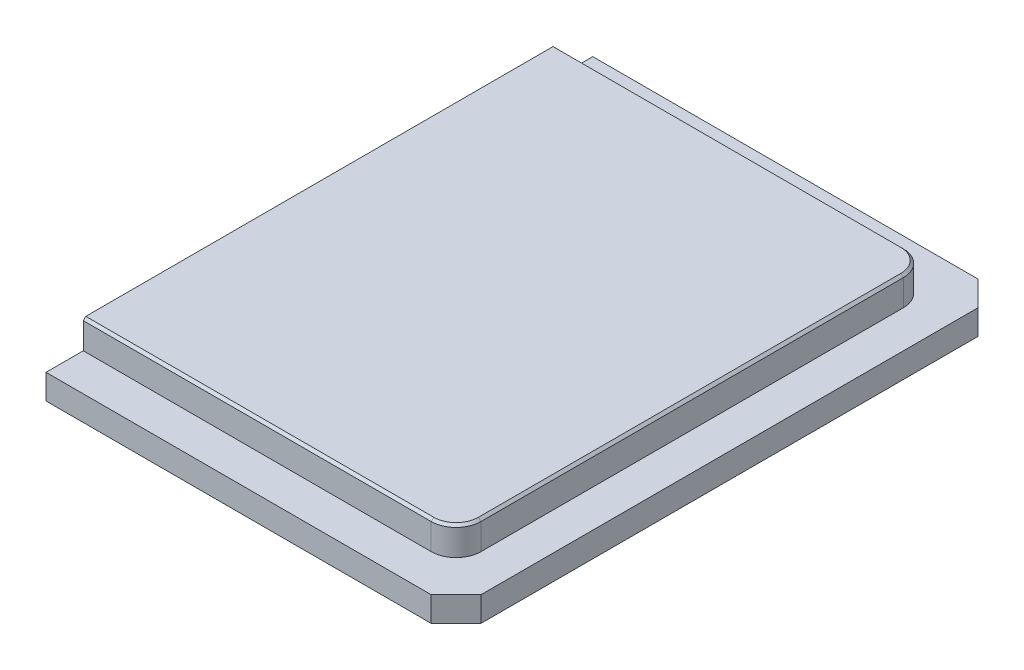
ISO-10303-21;
HEADER;
FILE_DESCRIPTION(('STEP AP214'),'2;1');
FILE_NAME('part.step','',(''),(''),'','','');
FILE_SCHEMA(('AUTOMOTIVE_DESIGN { 1 0 10303 214 1 1 1 1 }'));
ENDSEC;
DATA;
#1=APPLICATION_CONTEXT('core data for automotive mechanical design processes');
#2=APPLICATION_PROTOCOL_DEFINITION('international standard','automotive_design',2000,#1);
#3=PRODUCT_CONTEXT('',#1,'mechanical');
#4=PRODUCT('Part','Part','',(#3));
#5=PRODUCT_RELATED_PRODUCT_CATEGORY('part','',(#4));
#6=PRODUCT_DEFINITION_FORMATION('','',#4);
#7=PRODUCT_DEFINITION_CONTEXT('part definition',#1,'design');
#8=PRODUCT_DEFINITION('design','',#6,#7);
#9=PRODUCT_DEFINITION_SHAPE('','',#8);
#10=(LENGTH_UNIT() NAMED_UNIT(*) SI_UNIT(.MILLI.,.METRE.));
#11=(NAMED_UNIT(*) PLANE_ANGLE_UNIT() SI_UNIT($,.RADIAN.));
#12=(NAMED_UNIT(*) SI_UNIT($,.STERADIAN.) SOLID_ANGLE_UNIT());
#13=UNCERTAINTY_MEASURE_WITH_UNIT(LENGTH_MEASURE(1.E-05),#10,'distance_accuracy_value','');
#14=(GEOMETRIC_REPRESENTATION_CONTEXT(3) GLOBAL_UNCERTAINTY_ASSIGNED_CONTEXT((#13)) GLOBAL_UNIT_ASSIGNED_CONTEXT((#10,
#11,#12)) REPRESENTATION_CONTEXT('',''));
#15=CARTESIAN_POINT('',(0.,0.,0.));
#16=DIRECTION('',(0.,0.,1.));
#17=DIRECTION('',(1.,0.,0.));
#18=AXIS2_PLACEMENT_3D('',#15,#16,#17);
#19=CARTESIAN_POINT('',(0.,2.3,0.));
#20=DIRECTION('',(1.,0.,0.));
#21=DIRECTION('',(0.,0.,-1.));
#22=AXIS2_PLACEMENT_3D('',#19,#20,#21);
#23=PLANE('',#22);
#24=DIRECTION('',(0.,-1.,0.));
#25=VECTOR('',#24,1.);
#26=CARTESIAN_POINT('',(0.,2.3,0.));
#27=LINE('',#26,#25);
#28=CARTESIAN_POINT('',(0.,2.1,0.));
#29=VERTEX_POINT('',#28);
#30=CARTESIAN_POINT('',(0.,0.,0.));
#31=VERTEX_POINT('',#30);
#32=EDGE_CURVE('E218',#29,#31,#27,.T.);
#33=ORIENTED_EDGE('',*,*,#32,.F.);
#34=DIRECTION('',(0.,-0.707106781186535,0.70710678118656));
#35=VECTOR('',#34,1.);
#36=CARTESIAN_POINT('',(0.,2.3,-0.200000000000006));
#37=LINE('',#36,#35);
#38=CARTESIAN_POINT('',(0.,2.3,-0.200000000000006));
#39=VERTEX_POINT('',#38);
#40=EDGE_CURVE('E210',#29,#39,#37,.F.);
#41=ORIENTED_EDGE('',*,*,#40,.T.);
#42=DIRECTION('',(0.,0.,1.));
#43=VECTOR('',#42,1.);
#44=CARTESIAN_POINT('',(0.,2.3,0.));
#45=LINE('',#44,#43);
#46=CARTESIAN_POINT('',(0.,2.3,-37.8));
#47=VERTEX_POINT('',#46);
#48=EDGE_CURVE('E219',#47,#39,#45,.T.);
#49=ORIENTED_EDGE('',*,*,#48,.F.);
#50=DIRECTION('',(0.,0.707106781186535,0.70710678118656));
#51=VECTOR('',#50,1.);
#52=CARTESIAN_POINT('',(0.,2.3,-37.8));
#53=LINE('',#52,#51);
#54=CARTESIAN_POINT('',(0.,2.1,-38.));
#55=VERTEX_POINT('',#54);
#56=EDGE_CURVE('E212',#47,#55,#53,.F.);
#57=ORIENTED_EDGE('',*,*,#56,.T.);
#58=DIRECTION('',(0.,-1.,0.));
#59=VECTOR('',#58,1.);
#60=CARTESIAN_POINT('',(0.,2.3,-38.));
#61=LINE('',#60,#59);
#62=CARTESIAN_POINT('',(0.,0.,-38.));
#63=VERTEX_POINT('',#62);
#64=EDGE_CURVE('E215',#55,#63,#61,.T.);
#65=ORIENTED_EDGE('',*,*,#64,.T.);
#66=DIRECTION('',(0.,0.,-1.));
#67=VECTOR('',#66,1.);
#68=CARTESIAN_POINT('',(0.,0.,3.));
#69=LINE('',#68,#67);
#70=CARTESIAN_POINT('',(0.,0.,-41.));
#71=VERTEX_POINT('',#70);
#72=EDGE_CURVE('E157',#63,#71,#69,.T.);
#73=ORIENTED_EDGE('',*,*,#72,.T.);
#74=DIRECTION('',(0.,1.,0.));
#75=VECTOR('',#74,1.);
#76=CARTESIAN_POINT('',(0.,-2.,-41.));
#77=LINE('',#76,#75);
#78=CARTESIAN_POINT('',(0.,-2.,-41.));
#79=VERTEX_POINT('',#78);
#80=EDGE_CURVE('E143',#79,#71,#77,.T.);
#81=ORIENTED_EDGE('',*,*,#80,.F.);
#82=DIRECTION('',(0.,0.,-1.));
#83=VECTOR('',#82,1.);
#84=CARTESIAN_POINT('',(0.,-2.,3.));
#85=LINE('',#84,#83);
#86=CARTESIAN_POINT('',(0.,-2.,3.));
#87=VERTEX_POINT('',#86);
#88=EDGE_CURVE('E128',#87,#79,#85,.T.);
#89=ORIENTED_EDGE('',*,*,#88,.F.);
#90=DIRECTION('',(0.,1.,0.));
#91=VECTOR('',#90,1.);
#92=CARTESIAN_POINT('',(0.,-2.,3.));
#93=LINE('',#92,#91);
#94=CARTESIAN_POINT('',(0.,0.,3.));
#95=VERTEX_POINT('',#94);
#96=EDGE_CURVE('E135',#87,#95,#93,.T.);
#97=ORIENTED_EDGE('',*,*,#96,.T.);
#98=EDGE_CURVE('E166',#95,#31,#69,.T.);
#99=ORIENTED_EDGE('',*,*,#98,.T.);
#100=EDGE_LOOP('',(#33,#41,#49,#57,#65,#73,#81,#89,#97,#99));
#101=FACE_BOUND('',#100,.T.);
#102=ADVANCED_FACE('F17',(#101),#23,.F.);
#103=CARTESIAN_POINT('',(0.,2.3,0.));
#104=DIRECTION('',(0.,0.,-1.));
#105=DIRECTION('',(-1.,0.,0.));
#106=AXIS2_PLACEMENT_3D('',#103,#104,#105);
#107=PLANE('',#106);
#108=DIRECTION('',(0.,-1.,0.));
#109=VECTOR('',#108,1.);
#110=CARTESIAN_POINT('',(28.,2.3,0.));
#111=LINE('',#110,#109);
#112=CARTESIAN_POINT('',(28.,0.,0.));
#113=VERTEX_POINT('',#112);
#114=CARTESIAN_POINT('',(28.,2.1,0.));
#115=VERTEX_POINT('',#114);
#116=EDGE_CURVE('E259',#113,#115,#111,.F.);
#117=ORIENTED_EDGE('',*,*,#116,.T.);
#118=DIRECTION('',(-1.,0.,0.));
#119=VECTOR('',#118,1.);
#120=CARTESIAN_POINT('',(0.,2.1,0.));
#121=LINE('',#120,#119);
#122=EDGE_CURVE('E214',#115,#29,#121,.T.);
#123=ORIENTED_EDGE('',*,*,#122,.T.);
#124=ORIENTED_EDGE('',*,*,#32,.T.);
#125=DIRECTION('',(1.,0.,0.));
#126=VECTOR('',#125,1.);
#127=CARTESIAN_POINT('',(0.,0.,0.));
#128=LINE('',#127,#126);
#129=EDGE_CURVE('E142',#31,#113,#128,.T.);
#130=ORIENTED_EDGE('',*,*,#129,.T.);
#131=EDGE_LOOP('',(#117,#123,#124,#130));
#132=FACE_BOUND('',#131,.T.);
#133=ADVANCED_FACE('F321',(#132),#107,.F.);
#134=CARTESIAN_POINT('',(30.,2.3,0.));
#135=DIRECTION('',(-1.,0.,0.));
#136=DIRECTION('',(0.,0.,1.));
#137=AXIS2_PLACEMENT_3D('',#134,#135,#136);
#138=PLANE('',#137);
#139=DIRECTION('',(0.,-1.,0.));
#140=VECTOR('',#139,1.);
#141=CARTESIAN_POINT('',(30.,2.3,-36.));
#142=LINE('',#141,#140);
#143=CARTESIAN_POINT('',(30.,0.,-36.));
#144=VERTEX_POINT('',#143);
#145=CARTESIAN_POINT('',(30.,2.1,-36.));
#146=VERTEX_POINT('',#145);
#147=EDGE_CURVE('E248',#144,#146,#142,.F.);
#148=ORIENTED_EDGE('',*,*,#147,.T.);
#149=DIRECTION('',(0.,0.,1.));
#150=VECTOR('',#149,1.);
#151=CARTESIAN_POINT('',(30.,2.1,0.));
#152=LINE('',#151,#150);
#153=CARTESIAN_POINT('',(30.,2.1,-2.));
#154=VERTEX_POINT('',#153);
#155=EDGE_CURVE('E192',#146,#154,#152,.T.);
#156=ORIENTED_EDGE('',*,*,#155,.T.);
#157=DIRECTION('',(0.,-1.,0.));
#158=VECTOR('',#157,1.);
#159=CARTESIAN_POINT('',(30.,2.3,-2.));
#160=LINE('',#159,#158);
#161=CARTESIAN_POINT('',(30.,0.,-2.));
#162=VERTEX_POINT('',#161);
#163=EDGE_CURVE('E251',#154,#162,#160,.T.);
#164=ORIENTED_EDGE('',*,*,#163,.T.);
#165=DIRECTION('',(0.,0.,-1.));
#166=VECTOR('',#165,1.);
#167=CARTESIAN_POINT('',(30.,0.,0.));
#168=LINE('',#167,#166);
#169=EDGE_CURVE('E230',#162,#144,#168,.T.);
#170=ORIENTED_EDGE('',*,*,#169,.T.);
#171=EDGE_LOOP('',(#148,#156,#164,#170));
#172=FACE_BOUND('',#171,.T.);
#173=ADVANCED_FACE('F247',(#172),#138,.F.);
#174=CARTESIAN_POINT('',(0.,2.3,-38.));
#175=DIRECTION('',(0.,0.,1.));
#176=DIRECTION('',(1.,0.,0.));
#177=AXIS2_PLACEMENT_3D('',#174,#175,#176);
#178=PLANE('',#177);
#179=ORIENTED_EDGE('',*,*,#64,.F.);
#180=DIRECTION('',(1.,0.,0.));
#181=VECTOR('',#180,1.);
#182=CARTESIAN_POINT('',(0.,2.1,-38.));
#183=LINE('',#182,#181);
#184=CARTESIAN_POINT('',(28.,2.1,-38.));
#185=VERTEX_POINT('',#184);
#186=EDGE_CURVE('E208',#55,#185,#183,.T.);
#187=ORIENTED_EDGE('',*,*,#186,.T.);
#188=DIRECTION('',(0.,-1.,0.));
#189=VECTOR('',#188,1.);
#190=CARTESIAN_POINT('',(28.,2.3,-38.));
#191=LINE('',#190,#189);
#192=CARTESIAN_POINT('',(28.,0.,-38.));
#193=VERTEX_POINT('',#192);
#194=EDGE_CURVE('E231',#185,#193,#191,.T.);
#195=ORIENTED_EDGE('',*,*,#194,.T.);
#196=DIRECTION('',(-1.,0.,0.));
#197=VECTOR('',#196,1.);
#198=CARTESIAN_POINT('',(0.,0.,-38.));
#199=LINE('',#198,#197);
#200=EDGE_CURVE('E226',#193,#63,#199,.T.);
#201=ORIENTED_EDGE('',*,*,#200,.T.);
#202=EDGE_LOOP('',(#179,#187,#195,#201));
#203=FACE_BOUND('',#202,.T.);
#204=ADVANCED_FACE('F278',(#203),#178,.F.);
#205=CARTESIAN_POINT('',(0.,2.3,-38.));
#206=DIRECTION('',(0.,-1.,0.));
#207=DIRECTION('',(0.,0.,-1.));
#208=AXIS2_PLACEMENT_3D('',#205,#206,#207);
#209=PLANE('',#208);
#210=ORIENTED_EDGE('',*,*,#48,.T.);
#211=DIRECTION('',(1.,0.,0.));
#212=VECTOR('',#211,1.);
#213=CARTESIAN_POINT('',(0.,2.3,-0.200000000000006));
#214=LINE('',#213,#212);
#215=CARTESIAN_POINT('',(28.,2.3,-0.200000000000004));
#216=VERTEX_POINT('',#215);
#217=EDGE_CURVE('E274',#39,#216,#214,.T.);
#218=ORIENTED_EDGE('',*,*,#217,.T.);
#219=CARTESIAN_POINT('',(28.,2.3,-2.));
#220=DIRECTION('',(0.,-1.,0.));
#221=DIRECTION('',(0.,0.,-1.));
#222=AXIS2_PLACEMENT_3D('',#219,#220,#221);
#223=CIRCLE('',#222,1.8);
#224=CARTESIAN_POINT('',(29.8,2.3,-2.));
#225=VERTEX_POINT('',#224);
#226=EDGE_CURVE('E270',#216,#225,#223,.F.);
#227=ORIENTED_EDGE('',*,*,#226,.T.);
#228=DIRECTION('',(0.,0.,-1.));
#229=VECTOR('',#228,1.);
#230=CARTESIAN_POINT('',(29.8,2.3,-38.));
#231=LINE('',#230,#229);
#232=CARTESIAN_POINT('',(29.8,2.3,-36.));
#233=VERTEX_POINT('',#232);
#234=EDGE_CURVE('E266',#225,#233,#231,.T.);
#235=ORIENTED_EDGE('',*,*,#234,.T.);
#236=CARTESIAN_POINT('',(28.,2.3,-36.));
#237=DIRECTION('',(0.,-1.,0.));
#238=DIRECTION('',(0.,0.,-1.));
#239=AXIS2_PLACEMENT_3D('',#236,#237,#238);
#240=CIRCLE('',#239,1.8);
#241=CARTESIAN_POINT('',(28.,2.3,-37.8));
#242=VERTEX_POINT('',#241);
#243=EDGE_CURVE('E268',#233,#242,#240,.F.);
#244=ORIENTED_EDGE('',*,*,#243,.T.);
#245=DIRECTION('',(-1.,0.,0.));
#246=VECTOR('',#245,1.);
#247=CARTESIAN_POINT('',(0.,2.3,-37.8));
#248=LINE('',#247,#246);
#249=EDGE_CURVE('E272',#242,#47,#248,.T.);
#250=ORIENTED_EDGE('',*,*,#249,.T.);
#251=EDGE_LOOP('',(#210,#218,#227,#235,#244,#250));
#252=FACE_BOUND('',#251,.T.);
#253=ADVANCED_FACE('F306',(#252),#209,.F.);
#254=CARTESIAN_POINT('',(33.,0.,-41.));
#255=DIRECTION('',(0.,1.,0.));
#256=DIRECTION('',(0.,0.,1.));
#257=AXIS2_PLACEMENT_3D('',#254,#255,#256);
#258=PLANE('',#257);
#259=DIRECTION('',(0.,0.,1.));
#260=VECTOR('',#259,1.);
#261=CARTESIAN_POINT('',(33.,0.,3.));
#262=LINE('',#261,#260);
#263=CARTESIAN_POINT('',(33.,0.,-39.));
#264=VERTEX_POINT('',#263);
#265=CARTESIAN_POINT('',(33.,0.,1.));
#266=VERTEX_POINT('',#265);
#267=EDGE_CURVE('E152',#264,#266,#262,.T.);
#268=ORIENTED_EDGE('',*,*,#267,.F.);
#269=DIRECTION('',(0.707106781186548,0.,0.707106781186548));
#270=VECTOR('',#269,1.);
#271=CARTESIAN_POINT('',(32.,0.,-40.));
#272=LINE('',#271,#270);
#273=CARTESIAN_POINT('',(31.,0.,-41.));
#274=VERTEX_POINT('',#273);
#275=EDGE_CURVE('E174',#264,#274,#272,.F.);
#276=ORIENTED_EDGE('',*,*,#275,.T.);
#277=DIRECTION('',(1.,0.,0.));
#278=VECTOR('',#277,1.);
#279=CARTESIAN_POINT('',(33.,0.,-41.));
#280=LINE('',#279,#278);
#281=EDGE_CURVE('E160',#71,#274,#280,.T.);
#282=ORIENTED_EDGE('',*,*,#281,.F.);
#283=ORIENTED_EDGE('',*,*,#72,.F.);
#284=ORIENTED_EDGE('',*,*,#200,.F.);
#285=CARTESIAN_POINT('',(28.,0.,-36.));
#286=DIRECTION('',(0.,1.,0.));
#287=DIRECTION('',(0.,0.,1.));
#288=AXIS2_PLACEMENT_3D('',#285,#286,#287);
#289=CIRCLE('',#288,2.);
#290=EDGE_CURVE('E257',#193,#144,#289,.F.);
#291=ORIENTED_EDGE('',*,*,#290,.T.);
#292=ORIENTED_EDGE('',*,*,#169,.F.);
#293=CARTESIAN_POINT('',(28.,0.,-2.));
#294=DIRECTION('',(0.,1.,0.));
#295=DIRECTION('',(0.,0.,1.));
#296=AXIS2_PLACEMENT_3D('',#293,#294,#295);
#297=CIRCLE('',#296,2.);
#298=EDGE_CURVE('E264',#162,#113,#297,.F.);
#299=ORIENTED_EDGE('',*,*,#298,.T.);
#300=ORIENTED_EDGE('',*,*,#129,.F.);
#301=ORIENTED_EDGE('',*,*,#98,.F.);
#302=DIRECTION('',(-1.,0.,0.));
#303=VECTOR('',#302,1.);
#304=CARTESIAN_POINT('',(0.,0.,3.));
#305=LINE('',#304,#303);
#306=CARTESIAN_POINT('',(31.,0.,3.));
#307=VERTEX_POINT('',#306);
#308=EDGE_CURVE('E138',#307,#95,#305,.T.);
#309=ORIENTED_EDGE('',*,*,#308,.F.);
#310=DIRECTION('',(-0.707106781186546,0.,0.707106781186549));
#311=VECTOR('',#310,1.);
#312=CARTESIAN_POINT('',(54.,0.,-20.));
#313=LINE('',#312,#311);
#314=EDGE_CURVE('E187',#307,#266,#313,.F.);
#315=ORIENTED_EDGE('',*,*,#314,.T.);
#316=EDGE_LOOP('',(#268,#276,#282,#283,#284,#291,#292,#299,#300,#301,#309,#315));
#317=FACE_BOUND('',#316,.T.);
#318=ADVANCED_FACE('F172',(#317),#258,.T.);
#319=CARTESIAN_POINT('',(33.,-2.,3.));
#320=DIRECTION('',(-1.,0.,0.));
#321=DIRECTION('',(0.,0.,1.));
#322=AXIS2_PLACEMENT_3D('',#319,#320,#321);
#323=PLANE('',#322);
#324=DIRECTION('',(0.,0.,1.));
#325=VECTOR('',#324,1.);
#326=CARTESIAN_POINT('',(33.,-2.,3.));
#327=LINE('',#326,#325);
#328=CARTESIAN_POINT('',(33.,-2.,-39.));
#329=VERTEX_POINT('',#328);
#330=CARTESIAN_POINT('',(33.,-2.,1.));
#331=VERTEX_POINT('',#330);
#332=EDGE_CURVE('E132',#329,#331,#327,.T.);
#333=ORIENTED_EDGE('',*,*,#332,.F.);
#334=DIRECTION('',(0.,1.,0.));
#335=VECTOR('',#334,1.);
#336=CARTESIAN_POINT('',(33.,-2.,-39.));
#337=LINE('',#336,#335);
#338=EDGE_CURVE('E189',#329,#264,#337,.T.);
#339=ORIENTED_EDGE('',*,*,#338,.T.);
#340=ORIENTED_EDGE('',*,*,#267,.T.);
#341=DIRECTION('',(0.,-1.,0.));
#342=VECTOR('',#341,1.);
#343=CARTESIAN_POINT('',(33.,-2.,1.));
#344=LINE('',#343,#342);
#345=EDGE_CURVE('E182',#266,#331,#344,.T.);
#346=ORIENTED_EDGE('',*,*,#345,.T.);
#347=EDGE_LOOP('',(#333,#339,#340,#346));
#348=FACE_BOUND('',#347,.T.);
#349=ADVANCED_FACE('F349',(#348),#323,.F.);
#350=CARTESIAN_POINT('',(0.,-2.,3.));
#351=DIRECTION('',(0.,0.,-1.));
#352=DIRECTION('',(-1.,0.,0.));
#353=AXIS2_PLACEMENT_3D('',#350,#351,#352);
#354=PLANE('',#353);
#355=DIRECTION('',(-1.,0.,0.));
#356=VECTOR('',#355,1.);
#357=CARTESIAN_POINT('',(0.,-2.,3.));
#358=LINE('',#357,#356);
#359=CARTESIAN_POINT('',(31.,-2.,3.));
#360=VERTEX_POINT('',#359);
#361=EDGE_CURVE('E124',#360,#87,#358,.T.);
#362=ORIENTED_EDGE('',*,*,#361,.F.);
#363=DIRECTION('',(0.,1.,0.));
#364=VECTOR('',#363,1.);
#365=CARTESIAN_POINT('',(31.,-2.,3.));
#366=LINE('',#365,#364);
#367=EDGE_CURVE('E11',#360,#307,#366,.T.);
#368=ORIENTED_EDGE('',*,*,#367,.T.);
#369=ORIENTED_EDGE('',*,*,#308,.T.);
#370=ORIENTED_EDGE('',*,*,#96,.F.);
#371=EDGE_LOOP('',(#362,#368,#369,#370));
#372=FACE_BOUND('',#371,.T.);
#373=ADVANCED_FACE('F136',(#372),#354,.F.);
#374=CARTESIAN_POINT('',(33.,-2.,-41.));
#375=DIRECTION('',(0.,0.,1.));
#376=DIRECTION('',(1.,0.,0.));
#377=AXIS2_PLACEMENT_3D('',#374,#375,#376);
#378=PLANE('',#377);
#379=ORIENTED_EDGE('',*,*,#281,.T.);
#380=DIRECTION('',(0.,-1.,0.));
#381=VECTOR('',#380,1.);
#382=CARTESIAN_POINT('',(31.,-2.,-41.));
#383=LINE('',#382,#381);
#384=CARTESIAN_POINT('',(31.,-2.,-41.));
#385=VERTEX_POINT('',#384);
#386=EDGE_CURVE('E40',#274,#385,#383,.T.);
#387=ORIENTED_EDGE('',*,*,#386,.T.);
#388=DIRECTION('',(1.,0.,0.));
#389=VECTOR('',#388,1.);
#390=CARTESIAN_POINT('',(33.,-2.,-41.));
#391=LINE('',#390,#389);
#392=EDGE_CURVE('E147',#79,#385,#391,.T.);
#393=ORIENTED_EDGE('',*,*,#392,.F.);
#394=ORIENTED_EDGE('',*,*,#80,.T.);
#395=EDGE_LOOP('',(#379,#387,#393,#394));
#396=FACE_BOUND('',#395,.T.);
#397=ADVANCED_FACE('F168',(#396),#378,.F.);
#398=CARTESIAN_POINT('',(33.,-2.,-41.));
#399=DIRECTION('',(0.,1.,0.));
#400=DIRECTION('',(0.,0.,1.));
#401=AXIS2_PLACEMENT_3D('',#398,#399,#400);
#402=PLANE('',#401);
#403=ORIENTED_EDGE('',*,*,#392,.T.);
#404=DIRECTION('',(-0.707106781186548,0.,-0.707106781186548));
#405=VECTOR('',#404,1.);
#406=CARTESIAN_POINT('',(33.,-2.,-39.));
#407=LINE('',#406,#405);
#408=EDGE_CURVE('E25',#385,#329,#407,.F.);
#409=ORIENTED_EDGE('',*,*,#408,.T.);
#410=ORIENTED_EDGE('',*,*,#332,.T.);
#411=DIRECTION('',(0.707106781186546,0.,-0.707106781186549));
#412=VECTOR('',#411,1.);
#413=CARTESIAN_POINT('',(31.,-2.,3.));
#414=LINE('',#413,#412);
#415=EDGE_CURVE('E32',#331,#360,#414,.F.);
#416=ORIENTED_EDGE('',*,*,#415,.T.);
#417=ORIENTED_EDGE('',*,*,#361,.T.);
#418=ORIENTED_EDGE('',*,*,#88,.T.);
#419=EDGE_LOOP('',(#403,#409,#410,#416,#417,#418));
#420=FACE_BOUND('',#419,.T.);
#421=ADVANCED_FACE('F126',(#420),#402,.F.);
#422=CARTESIAN_POINT('',(28.,2.3,-36.));
#423=DIRECTION('',(0.,-1.,0.));
#424=DIRECTION('',(0.,0.,-1.));
#425=AXIS2_PLACEMENT_3D('',#422,#423,#424);
#426=CYLINDRICAL_SURFACE('',#425,2.);
#427=ORIENTED_EDGE('',*,*,#194,.F.);
#428=CARTESIAN_POINT('',(28.,2.1,-36.));
#429=DIRECTION('',(0.,-1.,0.));
#430=DIRECTION('',(0.,0.,-1.));
#431=AXIS2_PLACEMENT_3D('',#428,#429,#430);
#432=CIRCLE('',#431,2.);
#433=EDGE_CURVE('E204',#185,#146,#432,.T.);
#434=ORIENTED_EDGE('',*,*,#433,.T.);
#435=ORIENTED_EDGE('',*,*,#147,.F.);
#436=ORIENTED_EDGE('',*,*,#290,.F.);
#437=EDGE_LOOP('',(#427,#434,#435,#436));
#438=FACE_BOUND('',#437,.T.);
#439=ADVANCED_FACE('F256',(#438),#426,.T.);
#440=CARTESIAN_POINT('',(28.,2.3,-2.));
#441=DIRECTION('',(0.,-1.,0.));
#442=DIRECTION('',(0.,0.,-1.));
#443=AXIS2_PLACEMENT_3D('',#440,#441,#442);
#444=CYLINDRICAL_SURFACE('',#443,2.);
#445=ORIENTED_EDGE('',*,*,#163,.F.);
#446=CARTESIAN_POINT('',(28.,2.1,-2.));
#447=DIRECTION('',(0.,-1.,0.));
#448=DIRECTION('',(0.,0.,-1.));
#449=AXIS2_PLACEMENT_3D('',#446,#447,#448);
#450=CIRCLE('',#449,2.);
#451=EDGE_CURVE('E206',#154,#115,#450,.T.);
#452=ORIENTED_EDGE('',*,*,#451,.T.);
#453=ORIENTED_EDGE('',*,*,#116,.F.);
#454=ORIENTED_EDGE('',*,*,#298,.F.);
#455=EDGE_LOOP('',(#445,#452,#453,#454));
#456=FACE_BOUND('',#455,.T.);
#457=ADVANCED_FACE('F295',(#456),#444,.T.);
#458=CARTESIAN_POINT('',(0.,2.3,-37.8));
#459=DIRECTION('',(0.,-0.70710678118656,0.707106781186535));
#460=DIRECTION('',(0.,-0.707106781186535,-0.70710678118656));
#461=AXIS2_PLACEMENT_3D('',#458,#459,#460);
#462=PLANE('',#461);
#463=ORIENTED_EDGE('',*,*,#56,.F.);
#464=ORIENTED_EDGE('',*,*,#249,.F.);
#465=DIRECTION('',(0.,0.707106781186535,0.70710678118656));
#466=VECTOR('',#465,1.);
#467=CARTESIAN_POINT('',(28.,2.1,-38.));
#468=LINE('',#467,#466);
#469=EDGE_CURVE('E155',#185,#242,#468,.T.);
#470=ORIENTED_EDGE('',*,*,#469,.F.);
#471=ORIENTED_EDGE('',*,*,#186,.F.);
#472=EDGE_LOOP('',(#463,#464,#470,#471));
#473=FACE_BOUND('',#472,.T.);
#474=ADVANCED_FACE('F284',(#473),#462,.F.);
#475=CARTESIAN_POINT('',(28.,2.3,-36.));
#476=DIRECTION('',(0.,-1.,0.));
#477=DIRECTION('',(0.,0.,-1.));
#478=AXIS2_PLACEMENT_3D('',#475,#476,#477);
#479=CONICAL_SURFACE('',#478,1.8,0.785398163397462);
#480=ORIENTED_EDGE('',*,*,#469,.T.);
#481=ORIENTED_EDGE('',*,*,#243,.F.);
#482=DIRECTION('',(-0.70710678118656,0.707106781186535,0.));
#483=VECTOR('',#482,1.);
#484=CARTESIAN_POINT('',(30.,2.1,-36.));
#485=LINE('',#484,#483);
#486=EDGE_CURVE('E195',#146,#233,#485,.T.);
#487=ORIENTED_EDGE('',*,*,#486,.F.);
#488=ORIENTED_EDGE('',*,*,#433,.F.);
#489=EDGE_LOOP('',(#480,#481,#487,#488));
#490=FACE_BOUND('',#489,.T.);
#491=ADVANCED_FACE('F287',(#490),#479,.T.);
#492=CARTESIAN_POINT('',(29.8,2.3,-38.));
#493=DIRECTION('',(-0.707106781186535,-0.70710678118656,0.));
#494=DIRECTION('',(0.70710678118656,-0.707106781186535,0.));
#495=AXIS2_PLACEMENT_3D('',#492,#493,#494);
#496=PLANE('',#495);
#497=ORIENTED_EDGE('',*,*,#486,.T.);
#498=ORIENTED_EDGE('',*,*,#234,.F.);
#499=DIRECTION('',(-0.70710678118656,0.707106781186535,0.));
#500=VECTOR('',#499,1.);
#501=CARTESIAN_POINT('',(30.,2.1,-2.));
#502=LINE('',#501,#500);
#503=EDGE_CURVE('E198',#154,#225,#502,.T.);
#504=ORIENTED_EDGE('',*,*,#503,.F.);
#505=ORIENTED_EDGE('',*,*,#155,.F.);
#506=EDGE_LOOP('',(#497,#498,#504,#505));
#507=FACE_BOUND('',#506,.T.);
#508=ADVANCED_FACE('F292',(#507),#496,.F.);
#509=CARTESIAN_POINT('',(28.,2.3,-2.));
#510=DIRECTION('',(0.,-1.,0.));
#511=DIRECTION('',(0.,0.,-1.));
#512=AXIS2_PLACEMENT_3D('',#509,#510,#511);
#513=CONICAL_SURFACE('',#512,1.8,0.785398163397462);
#514=ORIENTED_EDGE('',*,*,#503,.T.);
#515=ORIENTED_EDGE('',*,*,#226,.F.);
#516=DIRECTION('',(0.,0.707106781186538,-0.707106781186557));
#517=VECTOR('',#516,1.);
#518=CARTESIAN_POINT('',(28.,2.1,0.));
#519=LINE('',#518,#517);
#520=EDGE_CURVE('E201',#115,#216,#519,.T.);
#521=ORIENTED_EDGE('',*,*,#520,.F.);
#522=ORIENTED_EDGE('',*,*,#451,.F.);
#523=EDGE_LOOP('',(#514,#515,#521,#522));
#524=FACE_BOUND('',#523,.T.);
#525=ADVANCED_FACE('F308',(#524),#513,.T.);
#526=CARTESIAN_POINT('',(0.,2.3,-0.200000000000006));
#527=DIRECTION('',(0.,-0.70710678118656,-0.707106781186535));
#528=DIRECTION('',(0.,0.707106781186535,-0.70710678118656));
#529=AXIS2_PLACEMENT_3D('',#526,#527,#528);
#530=PLANE('',#529);
#531=ORIENTED_EDGE('',*,*,#40,.F.);
#532=ORIENTED_EDGE('',*,*,#122,.F.);
#533=ORIENTED_EDGE('',*,*,#520,.T.);
#534=ORIENTED_EDGE('',*,*,#217,.F.);
#535=EDGE_LOOP('',(#531,#532,#533,#534));
#536=FACE_BOUND('',#535,.T.);
#537=ADVANCED_FACE('F302',(#536),#530,.F.);
#538=CARTESIAN_POINT('',(33.,-2.,-39.));
#539=DIRECTION('',(-0.707106781186548,0.,0.707106781186548));
#540=DIRECTION('',(0.707106781186548,0.,0.707106781186548));
#541=AXIS2_PLACEMENT_3D('',#538,#539,#540);
#542=PLANE('',#541);
#543=ORIENTED_EDGE('',*,*,#408,.F.);
#544=ORIENTED_EDGE('',*,*,#386,.F.);
#545=ORIENTED_EDGE('',*,*,#275,.F.);
#546=ORIENTED_EDGE('',*,*,#338,.F.);
#547=EDGE_LOOP('',(#543,#544,#545,#546));
#548=FACE_BOUND('',#547,.T.);
#549=ADVANCED_FACE('F317',(#548),#542,.F.);
#550=CARTESIAN_POINT('',(31.,-2.,3.));
#551=DIRECTION('',(-0.707106781186549,0.,-0.707106781186546));
#552=DIRECTION('',(-0.707106781186546,0.,0.707106781186549));
#553=AXIS2_PLACEMENT_3D('',#550,#551,#552);
#554=PLANE('',#553);
#555=ORIENTED_EDGE('',*,*,#415,.F.);
#556=ORIENTED_EDGE('',*,*,#345,.F.);
#557=ORIENTED_EDGE('',*,*,#314,.F.);
#558=ORIENTED_EDGE('',*,*,#367,.F.);
#559=EDGE_LOOP('',(#555,#556,#557,#558));
#560=FACE_BOUND('',#559,.T.);
#561=ADVANCED_FACE('F19',(#560),#554,.F.);
#562=CLOSED_SHELL('',(#102,#133,#173,#204,#253,#318,#349,#373,#397,#421,#439,#457,#474,#491,
#508,#525,#537,#549,#561));
#563=MANIFOLD_SOLID_BREP('B1',#562);
#564=ADVANCED_BREP_SHAPE_REPRESENTATION('',(#18,#563),#14);
#565=SHAPE_DEFINITION_REPRESENTATION(#9,#564);
ENDSEC;
END-ISO-10303-21;
